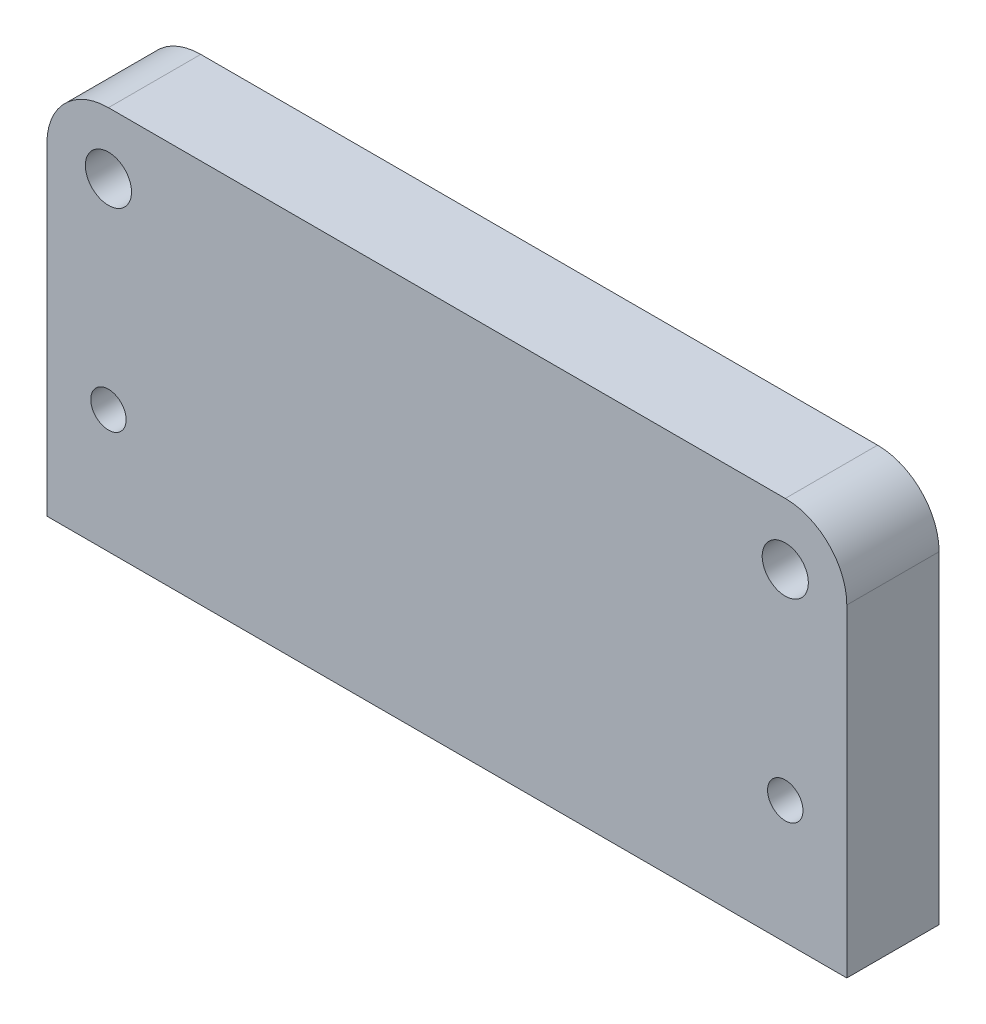
ISO-10303-21;
HEADER;
FILE_DESCRIPTION(('STEP AP214'),'2;1');
FILE_NAME('part.step','',(''),(''),'','','');
FILE_SCHEMA(('AUTOMOTIVE_DESIGN { 1 0 10303 214 1 1 1 1 }'));
ENDSEC;
DATA;
#1=APPLICATION_CONTEXT('core data for automotive mechanical design processes');
#2=APPLICATION_PROTOCOL_DEFINITION('international standard','automotive_design',2000,#1);
#3=PRODUCT_CONTEXT('',#1,'mechanical');
#4=PRODUCT('Part','Part','',(#3));
#5=PRODUCT_RELATED_PRODUCT_CATEGORY('part','',(#4));
#6=PRODUCT_DEFINITION_FORMATION('','',#4);
#7=PRODUCT_DEFINITION_CONTEXT('part definition',#1,'design');
#8=PRODUCT_DEFINITION('design','',#6,#7);
#9=PRODUCT_DEFINITION_SHAPE('','',#8);
#10=(LENGTH_UNIT() NAMED_UNIT(*) SI_UNIT(.MILLI.,.METRE.));
#11=(NAMED_UNIT(*) PLANE_ANGLE_UNIT() SI_UNIT($,.RADIAN.));
#12=(NAMED_UNIT(*) SI_UNIT($,.STERADIAN.) SOLID_ANGLE_UNIT());
#13=UNCERTAINTY_MEASURE_WITH_UNIT(LENGTH_MEASURE(1.E-05),#10,'distance_accuracy_value','');
#14=(GEOMETRIC_REPRESENTATION_CONTEXT(3) GLOBAL_UNCERTAINTY_ASSIGNED_CONTEXT((#13)) GLOBAL_UNIT_ASSIGNED_CONTEXT((#10,
#11,#12)) REPRESENTATION_CONTEXT('',''));
#15=CARTESIAN_POINT('',(0.,0.,0.));
#16=DIRECTION('',(0.,0.,1.));
#17=DIRECTION('',(1.,0.,0.));
#18=AXIS2_PLACEMENT_3D('',#15,#16,#17);
#19=CARTESIAN_POINT('',(4.,21.,6.));
#20=DIRECTION('',(0.,0.,1.));
#21=DIRECTION('',(1.,0.,0.));
#22=AXIS2_PLACEMENT_3D('',#19,#20,#21);
#23=PLANE('',#22);
#24=CARTESIAN_POINT('',(4.,8.,6.));
#25=DIRECTION('',(0.,0.,1.));
#26=DIRECTION('',(1.,0.,0.));
#27=AXIS2_PLACEMENT_3D('',#24,#25,#26);
#28=CIRCLE('',#27,1.15);
#29=CARTESIAN_POINT('',(5.15,8.,6.));
#30=VERTEX_POINT('',#29);
#31=EDGE_CURVE('E188',#30,#30,#28,.T.);
#32=ORIENTED_EDGE('',*,*,#31,.F.);
#33=EDGE_LOOP('',(#32));
#34=FACE_BOUND('',#33,.T.);
#35=CARTESIAN_POINT('',(4.,21.,6.));
#36=DIRECTION('',(0.,0.,1.));
#37=DIRECTION('',(1.,0.,0.));
#38=AXIS2_PLACEMENT_3D('',#35,#36,#37);
#39=CIRCLE('',#38,1.5);
#40=CARTESIAN_POINT('',(5.5,21.,6.));
#41=VERTEX_POINT('',#40);
#42=EDGE_CURVE('E120',#41,#41,#39,.T.);
#43=ORIENTED_EDGE('',*,*,#42,.F.);
#44=EDGE_LOOP('',(#43));
#45=FACE_BOUND('',#44,.T.);
#46=DIRECTION('',(0.,-1.,0.));
#47=VECTOR('',#46,1.);
#48=CARTESIAN_POINT('',(0.,0.,6.));
#49=LINE('',#48,#47);
#50=CARTESIAN_POINT('',(0.,21.,6.));
#51=VERTEX_POINT('',#50);
#52=CARTESIAN_POINT('',(0.,0.,6.));
#53=VERTEX_POINT('',#52);
#54=EDGE_CURVE('E127',#51,#53,#49,.T.);
#55=ORIENTED_EDGE('',*,*,#54,.T.);
#56=DIRECTION('',(1.,0.,0.));
#57=VECTOR('',#56,1.);
#58=CARTESIAN_POINT('',(0.,0.,6.));
#59=LINE('',#58,#57);
#60=CARTESIAN_POINT('',(52.,0.,6.));
#61=VERTEX_POINT('',#60);
#62=EDGE_CURVE('E85',#53,#61,#59,.T.);
#63=ORIENTED_EDGE('',*,*,#62,.T.);
#64=DIRECTION('',(0.,1.,0.));
#65=VECTOR('',#64,1.);
#66=CARTESIAN_POINT('',(52.,0.,6.));
#67=LINE('',#66,#65);
#68=CARTESIAN_POINT('',(52.,21.,6.));
#69=VERTEX_POINT('',#68);
#70=EDGE_CURVE('E98',#61,#69,#67,.T.);
#71=ORIENTED_EDGE('',*,*,#70,.T.);
#72=CARTESIAN_POINT('',(48.,21.,6.));
#73=DIRECTION('',(0.,0.,1.));
#74=DIRECTION('',(-1.,0.,0.));
#75=AXIS2_PLACEMENT_3D('',#72,#73,#74);
#76=CIRCLE('',#75,4.);
#77=CARTESIAN_POINT('',(48.,25.,6.));
#78=VERTEX_POINT('',#77);
#79=EDGE_CURVE('E92',#69,#78,#76,.T.);
#80=ORIENTED_EDGE('',*,*,#79,.T.);
#81=DIRECTION('',(-1.,0.,0.));
#82=VECTOR('',#81,1.);
#83=CARTESIAN_POINT('',(48.,25.,6.));
#84=LINE('',#83,#82);
#85=CARTESIAN_POINT('',(4.,25.,6.));
#86=VERTEX_POINT('',#85);
#87=EDGE_CURVE('E96',#78,#86,#84,.T.);
#88=ORIENTED_EDGE('',*,*,#87,.T.);
#89=CARTESIAN_POINT('',(4.,21.,6.));
#90=DIRECTION('',(0.,0.,1.));
#91=DIRECTION('',(1.,0.,0.));
#92=AXIS2_PLACEMENT_3D('',#89,#90,#91);
#93=CIRCLE('',#92,4.);
#94=EDGE_CURVE('E48',#86,#51,#93,.T.);
#95=ORIENTED_EDGE('',*,*,#94,.T.);
#96=EDGE_LOOP('',(#55,#63,#71,#80,#88,#95));
#97=FACE_BOUND('',#96,.T.);
#98=CARTESIAN_POINT('',(48.,21.,6.));
#99=DIRECTION('',(0.,0.,1.));
#100=DIRECTION('',(1.,0.,0.));
#101=AXIS2_PLACEMENT_3D('',#98,#99,#100);
#102=CIRCLE('',#101,1.5);
#103=CARTESIAN_POINT('',(49.5,21.,6.));
#104=VERTEX_POINT('',#103);
#105=EDGE_CURVE('E194',#104,#104,#102,.T.);
#106=ORIENTED_EDGE('',*,*,#105,.F.);
#107=EDGE_LOOP('',(#106));
#108=FACE_BOUND('',#107,.T.);
#109=CARTESIAN_POINT('',(48.,8.,6.));
#110=DIRECTION('',(0.,0.,1.));
#111=DIRECTION('',(1.,0.,0.));
#112=AXIS2_PLACEMENT_3D('',#109,#110,#111);
#113=CIRCLE('',#112,1.15);
#114=CARTESIAN_POINT('',(49.15,8.,6.));
#115=VERTEX_POINT('',#114);
#116=EDGE_CURVE('E179',#115,#115,#113,.T.);
#117=ORIENTED_EDGE('',*,*,#116,.F.);
#118=EDGE_LOOP('',(#117));
#119=FACE_BOUND('',#118,.T.);
#120=ADVANCED_FACE('F31',(#34,#45,#97,#108,#119),#23,.T.);
#121=CARTESIAN_POINT('',(4.,21.,0.));
#122=DIRECTION('',(0.,0.,1.));
#123=DIRECTION('',(1.,0.,0.));
#124=AXIS2_PLACEMENT_3D('',#121,#122,#123);
#125=PLANE('',#124);
#126=CARTESIAN_POINT('',(4.,8.,0.));
#127=DIRECTION('',(0.,0.,1.));
#128=DIRECTION('',(1.,0.,0.));
#129=AXIS2_PLACEMENT_3D('',#126,#127,#128);
#130=CIRCLE('',#129,1.15);
#131=CARTESIAN_POINT('',(5.15,8.,0.));
#132=VERTEX_POINT('',#131);
#133=EDGE_CURVE('E185',#132,#132,#130,.T.);
#134=ORIENTED_EDGE('',*,*,#133,.T.);
#135=EDGE_LOOP('',(#134));
#136=FACE_BOUND('',#135,.T.);
#137=CARTESIAN_POINT('',(4.,21.,0.));
#138=DIRECTION('',(0.,0.,1.));
#139=DIRECTION('',(1.,0.,0.));
#140=AXIS2_PLACEMENT_3D('',#137,#138,#139);
#141=CIRCLE('',#140,1.5);
#142=CARTESIAN_POINT('',(5.5,21.,0.));
#143=VERTEX_POINT('',#142);
#144=EDGE_CURVE('E197',#143,#143,#141,.T.);
#145=ORIENTED_EDGE('',*,*,#144,.T.);
#146=EDGE_LOOP('',(#145));
#147=FACE_BOUND('',#146,.T.);
#148=DIRECTION('',(0.,-1.,0.));
#149=VECTOR('',#148,1.);
#150=CARTESIAN_POINT('',(0.,0.,0.));
#151=LINE('',#150,#149);
#152=CARTESIAN_POINT('',(0.,21.,0.));
#153=VERTEX_POINT('',#152);
#154=CARTESIAN_POINT('',(0.,0.,0.));
#155=VERTEX_POINT('',#154);
#156=EDGE_CURVE('E116',#153,#155,#151,.T.);
#157=ORIENTED_EDGE('',*,*,#156,.F.);
#158=CARTESIAN_POINT('',(4.,21.,0.));
#159=DIRECTION('',(0.,0.,1.));
#160=DIRECTION('',(1.,0.,0.));
#161=AXIS2_PLACEMENT_3D('',#158,#159,#160);
#162=CIRCLE('',#161,4.);
#163=CARTESIAN_POINT('',(4.,25.,0.));
#164=VERTEX_POINT('',#163);
#165=EDGE_CURVE('E77',#164,#153,#162,.T.);
#166=ORIENTED_EDGE('',*,*,#165,.F.);
#167=DIRECTION('',(-1.,0.,0.));
#168=VECTOR('',#167,1.);
#169=CARTESIAN_POINT('',(48.,25.,0.));
#170=LINE('',#169,#168);
#171=CARTESIAN_POINT('',(48.,25.,0.));
#172=VERTEX_POINT('',#171);
#173=EDGE_CURVE('E71',#172,#164,#170,.T.);
#174=ORIENTED_EDGE('',*,*,#173,.F.);
#175=CARTESIAN_POINT('',(48.,21.,0.));
#176=DIRECTION('',(0.,0.,1.));
#177=DIRECTION('',(-1.,0.,0.));
#178=AXIS2_PLACEMENT_3D('',#175,#176,#177);
#179=CIRCLE('',#178,4.);
#180=CARTESIAN_POINT('',(52.,21.,0.));
#181=VERTEX_POINT('',#180);
#182=EDGE_CURVE('E106',#181,#172,#179,.T.);
#183=ORIENTED_EDGE('',*,*,#182,.F.);
#184=DIRECTION('',(0.,1.,0.));
#185=VECTOR('',#184,1.);
#186=CARTESIAN_POINT('',(52.,0.,0.));
#187=LINE('',#186,#185);
#188=CARTESIAN_POINT('',(52.,0.,0.));
#189=VERTEX_POINT('',#188);
#190=EDGE_CURVE('E122',#189,#181,#187,.T.);
#191=ORIENTED_EDGE('',*,*,#190,.F.);
#192=DIRECTION('',(1.,0.,0.));
#193=VECTOR('',#192,1.);
#194=CARTESIAN_POINT('',(0.,0.,0.));
#195=LINE('',#194,#193);
#196=EDGE_CURVE('E119',#155,#189,#195,.T.);
#197=ORIENTED_EDGE('',*,*,#196,.F.);
#198=EDGE_LOOP('',(#157,#166,#174,#183,#191,#197));
#199=FACE_BOUND('',#198,.T.);
#200=CARTESIAN_POINT('',(48.,21.,0.));
#201=DIRECTION('',(0.,0.,1.));
#202=DIRECTION('',(1.,0.,0.));
#203=AXIS2_PLACEMENT_3D('',#200,#201,#202);
#204=CIRCLE('',#203,1.5);
#205=CARTESIAN_POINT('',(49.5,21.,0.));
#206=VERTEX_POINT('',#205);
#207=EDGE_CURVE('E191',#206,#206,#204,.T.);
#208=ORIENTED_EDGE('',*,*,#207,.T.);
#209=EDGE_LOOP('',(#208));
#210=FACE_BOUND('',#209,.T.);
#211=CARTESIAN_POINT('',(48.,8.,0.));
#212=DIRECTION('',(0.,0.,1.));
#213=DIRECTION('',(1.,0.,0.));
#214=AXIS2_PLACEMENT_3D('',#211,#212,#213);
#215=CIRCLE('',#214,1.15);
#216=CARTESIAN_POINT('',(49.15,8.,0.));
#217=VERTEX_POINT('',#216);
#218=EDGE_CURVE('E182',#217,#217,#215,.T.);
#219=ORIENTED_EDGE('',*,*,#218,.T.);
#220=EDGE_LOOP('',(#219));
#221=FACE_BOUND('',#220,.T.);
#222=ADVANCED_FACE('F136',(#136,#147,#199,#210,#221),#125,.F.);
#223=CARTESIAN_POINT('',(0.,0.,6.));
#224=DIRECTION('',(1.,0.,0.));
#225=DIRECTION('',(0.,0.,-1.));
#226=AXIS2_PLACEMENT_3D('',#223,#224,#225);
#227=PLANE('',#226);
#228=ORIENTED_EDGE('',*,*,#156,.T.);
#229=DIRECTION('',(0.,0.,-1.));
#230=VECTOR('',#229,1.);
#231=CARTESIAN_POINT('',(0.,0.,6.));
#232=LINE('',#231,#230);
#233=EDGE_CURVE('E11',#53,#155,#232,.T.);
#234=ORIENTED_EDGE('',*,*,#233,.F.);
#235=ORIENTED_EDGE('',*,*,#54,.F.);
#236=DIRECTION('',(0.,0.,-1.));
#237=VECTOR('',#236,1.);
#238=CARTESIAN_POINT('',(0.,21.,6.));
#239=LINE('',#238,#237);
#240=EDGE_CURVE('E112',#51,#153,#239,.T.);
#241=ORIENTED_EDGE('',*,*,#240,.T.);
#242=EDGE_LOOP('',(#228,#234,#235,#241));
#243=FACE_BOUND('',#242,.T.);
#244=ADVANCED_FACE('F33',(#243),#227,.F.);
#245=CARTESIAN_POINT('',(0.,0.,6.));
#246=DIRECTION('',(0.,1.,0.));
#247=DIRECTION('',(0.,0.,1.));
#248=AXIS2_PLACEMENT_3D('',#245,#246,#247);
#249=PLANE('',#248);
#250=ORIENTED_EDGE('',*,*,#196,.T.);
#251=DIRECTION('',(0.,0.,-1.));
#252=VECTOR('',#251,1.);
#253=CARTESIAN_POINT('',(52.,0.,6.));
#254=LINE('',#253,#252);
#255=EDGE_CURVE('E40',#61,#189,#254,.T.);
#256=ORIENTED_EDGE('',*,*,#255,.F.);
#257=ORIENTED_EDGE('',*,*,#62,.F.);
#258=ORIENTED_EDGE('',*,*,#233,.T.);
#259=EDGE_LOOP('',(#250,#256,#257,#258));
#260=FACE_BOUND('',#259,.T.);
#261=ADVANCED_FACE('F254',(#260),#249,.F.);
#262=CARTESIAN_POINT('',(52.,0.,6.));
#263=DIRECTION('',(-1.,0.,0.));
#264=DIRECTION('',(0.,-1.,0.));
#265=AXIS2_PLACEMENT_3D('',#262,#263,#264);
#266=PLANE('',#265);
#267=ORIENTED_EDGE('',*,*,#190,.T.);
#268=DIRECTION('',(0.,0.,-1.));
#269=VECTOR('',#268,1.);
#270=CARTESIAN_POINT('',(52.,21.,6.));
#271=LINE('',#270,#269);
#272=EDGE_CURVE('E107',#69,#181,#271,.T.);
#273=ORIENTED_EDGE('',*,*,#272,.F.);
#274=ORIENTED_EDGE('',*,*,#70,.F.);
#275=ORIENTED_EDGE('',*,*,#255,.T.);
#276=EDGE_LOOP('',(#267,#273,#274,#275));
#277=FACE_BOUND('',#276,.T.);
#278=ADVANCED_FACE('F133',(#277),#266,.F.);
#279=CARTESIAN_POINT('',(48.,21.,6.));
#280=DIRECTION('',(0.,0.,-1.));
#281=DIRECTION('',(-1.,0.,0.));
#282=AXIS2_PLACEMENT_3D('',#279,#280,#281);
#283=CYLINDRICAL_SURFACE('',#282,4.);
#284=ORIENTED_EDGE('',*,*,#182,.T.);
#285=DIRECTION('',(0.,0.,-1.));
#286=VECTOR('',#285,1.);
#287=CARTESIAN_POINT('',(48.,25.,6.));
#288=LINE('',#287,#286);
#289=EDGE_CURVE('E103',#78,#172,#288,.T.);
#290=ORIENTED_EDGE('',*,*,#289,.F.);
#291=ORIENTED_EDGE('',*,*,#79,.F.);
#292=ORIENTED_EDGE('',*,*,#272,.T.);
#293=EDGE_LOOP('',(#284,#290,#291,#292));
#294=FACE_BOUND('',#293,.T.);
#295=ADVANCED_FACE('F104',(#294),#283,.T.);
#296=CARTESIAN_POINT('',(48.,25.,6.));
#297=DIRECTION('',(0.,-1.,0.));
#298=DIRECTION('',(0.,0.,-1.));
#299=AXIS2_PLACEMENT_3D('',#296,#297,#298);
#300=PLANE('',#299);
#301=ORIENTED_EDGE('',*,*,#173,.T.);
#302=DIRECTION('',(0.,0.,-1.));
#303=VECTOR('',#302,1.);
#304=CARTESIAN_POINT('',(4.,25.,6.));
#305=LINE('',#304,#303);
#306=EDGE_CURVE('E108',#86,#164,#305,.T.);
#307=ORIENTED_EDGE('',*,*,#306,.F.);
#308=ORIENTED_EDGE('',*,*,#87,.F.);
#309=ORIENTED_EDGE('',*,*,#289,.T.);
#310=EDGE_LOOP('',(#301,#307,#308,#309));
#311=FACE_BOUND('',#310,.T.);
#312=ADVANCED_FACE('F110',(#311),#300,.F.);
#313=CARTESIAN_POINT('',(4.,21.,6.));
#314=DIRECTION('',(0.,0.,-1.));
#315=DIRECTION('',(-1.,0.,0.));
#316=AXIS2_PLACEMENT_3D('',#313,#314,#315);
#317=CYLINDRICAL_SURFACE('',#316,4.);
#318=ORIENTED_EDGE('',*,*,#165,.T.);
#319=ORIENTED_EDGE('',*,*,#240,.F.);
#320=ORIENTED_EDGE('',*,*,#94,.F.);
#321=ORIENTED_EDGE('',*,*,#306,.T.);
#322=EDGE_LOOP('',(#318,#319,#320,#321));
#323=FACE_BOUND('',#322,.T.);
#324=ADVANCED_FACE('F141',(#323),#317,.T.);
#325=CARTESIAN_POINT('',(4.,21.,6.));
#326=DIRECTION('',(0.,0.,-1.));
#327=DIRECTION('',(-1.,0.,0.));
#328=AXIS2_PLACEMENT_3D('',#325,#326,#327);
#329=CYLINDRICAL_SURFACE('',#328,1.5);
#330=ORIENTED_EDGE('',*,*,#42,.T.);
#331=EDGE_LOOP('',(#330));
#332=FACE_BOUND('',#331,.T.);
#333=ORIENTED_EDGE('',*,*,#144,.F.);
#334=EDGE_LOOP('',(#333));
#335=FACE_BOUND('',#334,.T.);
#336=ADVANCED_FACE('F143',(#332,#335),#329,.F.);
#337=CARTESIAN_POINT('',(48.,21.,6.));
#338=DIRECTION('',(0.,0.,-1.));
#339=DIRECTION('',(-1.,0.,0.));
#340=AXIS2_PLACEMENT_3D('',#337,#338,#339);
#341=CYLINDRICAL_SURFACE('',#340,1.5);
#342=ORIENTED_EDGE('',*,*,#105,.T.);
#343=EDGE_LOOP('',(#342));
#344=FACE_BOUND('',#343,.T.);
#345=ORIENTED_EDGE('',*,*,#207,.F.);
#346=EDGE_LOOP('',(#345));
#347=FACE_BOUND('',#346,.T.);
#348=ADVANCED_FACE('F149',(#344,#347),#341,.F.);
#349=CARTESIAN_POINT('',(4.,8.,6.));
#350=DIRECTION('',(0.,0.,-1.));
#351=DIRECTION('',(-1.,0.,0.));
#352=AXIS2_PLACEMENT_3D('',#349,#350,#351);
#353=CYLINDRICAL_SURFACE('',#352,1.15);
#354=ORIENTED_EDGE('',*,*,#31,.T.);
#355=EDGE_LOOP('',(#354));
#356=FACE_BOUND('',#355,.T.);
#357=ORIENTED_EDGE('',*,*,#133,.F.);
#358=EDGE_LOOP('',(#357));
#359=FACE_BOUND('',#358,.T.);
#360=ADVANCED_FACE('F166',(#356,#359),#353,.F.);
#361=CARTESIAN_POINT('',(48.,8.,6.));
#362=DIRECTION('',(0.,0.,-1.));
#363=DIRECTION('',(-1.,0.,0.));
#364=AXIS2_PLACEMENT_3D('',#361,#362,#363);
#365=CYLINDRICAL_SURFACE('',#364,1.15);
#366=ORIENTED_EDGE('',*,*,#116,.T.);
#367=EDGE_LOOP('',(#366));
#368=FACE_BOUND('',#367,.T.);
#369=ORIENTED_EDGE('',*,*,#218,.F.);
#370=EDGE_LOOP('',(#369));
#371=FACE_BOUND('',#370,.T.);
#372=ADVANCED_FACE('F170',(#368,#371),#365,.F.);
#373=CLOSED_SHELL('',(#120,#222,#244,#261,#278,#295,#312,#324,#336,#348,#360,#372));
#374=MANIFOLD_SOLID_BREP('B2',#373);
#375=ADVANCED_BREP_SHAPE_REPRESENTATION('',(#18,#374),#14);
#376=SHAPE_DEFINITION_REPRESENTATION(#9,#375);
ENDSEC;
END-ISO-10303-21;
